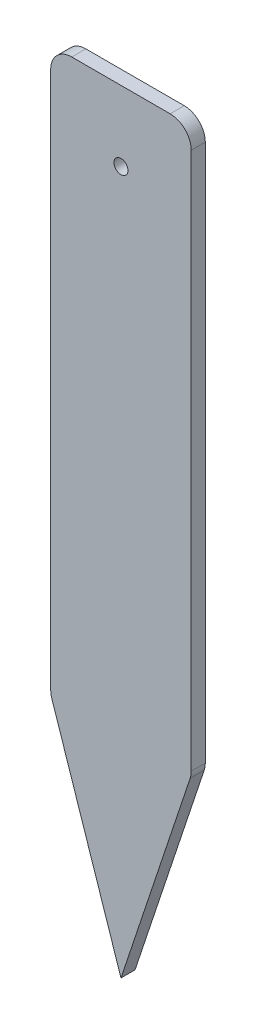
ISO-10303-21;
HEADER;
FILE_DESCRIPTION(('STEP AP214'),'2;1');
FILE_NAME('part.step','',(''),(''),'','','');
FILE_SCHEMA(('AUTOMOTIVE_DESIGN { 1 0 10303 214 1 1 1 1 }'));
ENDSEC;
DATA;
#1=APPLICATION_CONTEXT('core data for automotive mechanical design processes');
#2=APPLICATION_PROTOCOL_DEFINITION('international standard','automotive_design',2000,#1);
#3=PRODUCT_CONTEXT('',#1,'mechanical');
#4=PRODUCT('Part','Part','',(#3));
#5=PRODUCT_RELATED_PRODUCT_CATEGORY('part','',(#4));
#6=PRODUCT_DEFINITION_FORMATION('','',#4);
#7=PRODUCT_DEFINITION_CONTEXT('part definition',#1,'design');
#8=PRODUCT_DEFINITION('design','',#6,#7);
#9=PRODUCT_DEFINITION_SHAPE('','',#8);
#10=(LENGTH_UNIT() NAMED_UNIT(*) SI_UNIT(.MILLI.,.METRE.));
#11=(NAMED_UNIT(*) PLANE_ANGLE_UNIT() SI_UNIT($,.RADIAN.));
#12=(NAMED_UNIT(*) SI_UNIT($,.STERADIAN.) SOLID_ANGLE_UNIT());
#13=UNCERTAINTY_MEASURE_WITH_UNIT(LENGTH_MEASURE(1.E-05),#10,'distance_accuracy_value','');
#14=(GEOMETRIC_REPRESENTATION_CONTEXT(3) GLOBAL_UNCERTAINTY_ASSIGNED_CONTEXT((#13)) GLOBAL_UNIT_ASSIGNED_CONTEXT((#10,
#11,#12)) REPRESENTATION_CONTEXT('',''));
#15=CARTESIAN_POINT('',(0.,0.,0.));
#16=DIRECTION('',(0.,0.,1.));
#17=DIRECTION('',(1.,0.,0.));
#18=AXIS2_PLACEMENT_3D('',#15,#16,#17);
#19=CARTESIAN_POINT('',(7.,30.4868329805051,2.));
#20=DIRECTION('',(0.,0.,1.));
#21=DIRECTION('',(1.,0.,0.));
#22=AXIS2_PLACEMENT_3D('',#19,#20,#21);
#23=PLANE('',#22);
#24=CARTESIAN_POINT('',(7.,30.4868329805051,2.));
#25=DIRECTION('',(0.,0.,1.));
#26=DIRECTION('',(1.,0.,0.));
#27=AXIS2_PLACEMENT_3D('',#24,#25,#26);
#28=CIRCLE('',#27,3.);
#29=CARTESIAN_POINT('',(9.84604989415154,29.5381496824546,2.));
#30=VERTEX_POINT('',#29);
#31=CARTESIAN_POINT('',(10.,30.4868329805051,2.));
#32=VERTEX_POINT('',#31);
#33=EDGE_CURVE('E155',#30,#32,#28,.T.);
#34=ORIENTED_EDGE('',*,*,#33,.T.);
#35=DIRECTION('',(0.,1.,0.));
#36=VECTOR('',#35,1.);
#37=CARTESIAN_POINT('',(10.,30.4868329805051,2.));
#38=LINE('',#37,#36);
#39=CARTESIAN_POINT('',(10.,107.,2.));
#40=VERTEX_POINT('',#39);
#41=EDGE_CURVE('E98',#32,#40,#38,.T.);
#42=ORIENTED_EDGE('',*,*,#41,.T.);
#43=CARTESIAN_POINT('',(7.,107.,2.));
#44=DIRECTION('',(0.,0.,1.));
#45=DIRECTION('',(-1.,0.,0.));
#46=AXIS2_PLACEMENT_3D('',#43,#44,#45);
#47=CIRCLE('',#46,3.);
#48=CARTESIAN_POINT('',(6.99999999999998,110.,2.));
#49=VERTEX_POINT('',#48);
#50=EDGE_CURVE('E173',#40,#49,#47,.T.);
#51=ORIENTED_EDGE('',*,*,#50,.T.);
#52=DIRECTION('',(-1.,0.,0.));
#53=VECTOR('',#52,1.);
#54=CARTESIAN_POINT('',(-6.99999999999998,110.,2.));
#55=LINE('',#54,#53);
#56=CARTESIAN_POINT('',(-6.99999999999998,110.,2.));
#57=VERTEX_POINT('',#56);
#58=EDGE_CURVE('E190',#49,#57,#55,.T.);
#59=ORIENTED_EDGE('',*,*,#58,.T.);
#60=CARTESIAN_POINT('',(-7.,107.,2.));
#61=DIRECTION('',(0.,0.,1.));
#62=DIRECTION('',(-1.,0.,0.));
#63=AXIS2_PLACEMENT_3D('',#60,#61,#62);
#64=CIRCLE('',#63,3.);
#65=CARTESIAN_POINT('',(-10.,107.,2.));
#66=VERTEX_POINT('',#65);
#67=EDGE_CURVE('E189',#57,#66,#64,.T.);
#68=ORIENTED_EDGE('',*,*,#67,.T.);
#69=DIRECTION('',(0.,-1.,0.));
#70=VECTOR('',#69,1.);
#71=CARTESIAN_POINT('',(-10.,30.4868329805051,2.));
#72=LINE('',#71,#70);
#73=CARTESIAN_POINT('',(-10.,30.4868329805051,2.));
#74=VERTEX_POINT('',#73);
#75=EDGE_CURVE('E120',#66,#74,#72,.T.);
#76=ORIENTED_EDGE('',*,*,#75,.T.);
#77=CARTESIAN_POINT('',(-7.,30.4868329805051,2.));
#78=DIRECTION('',(0.,0.,1.));
#79=DIRECTION('',(-1.,0.,0.));
#80=AXIS2_PLACEMENT_3D('',#77,#78,#79);
#81=CIRCLE('',#80,3.);
#82=CARTESIAN_POINT('',(-9.84604989415154,29.5381496824546,2.));
#83=VERTEX_POINT('',#82);
#84=EDGE_CURVE('E114',#74,#83,#81,.T.);
#85=ORIENTED_EDGE('',*,*,#84,.T.);
#86=DIRECTION('',(0.316227766016838,-0.948683298050514,0.));
#87=VECTOR('',#86,1.);
#88=CARTESIAN_POINT('',(-9.84604989415154,29.5381496824546,2.));
#89=LINE('',#88,#87);
#90=CARTESIAN_POINT('',(0.,0.,2.));
#91=VERTEX_POINT('',#90);
#92=EDGE_CURVE('E118',#83,#91,#89,.T.);
#93=ORIENTED_EDGE('',*,*,#92,.T.);
#94=DIRECTION('',(0.316227766016838,0.948683298050514,0.));
#95=VECTOR('',#94,1.);
#96=CARTESIAN_POINT('',(0.,0.,2.));
#97=LINE('',#96,#95);
#98=EDGE_CURVE('E52',#91,#30,#97,.T.);
#99=ORIENTED_EDGE('',*,*,#98,.T.);
#100=EDGE_LOOP('',(#34,#42,#51,#59,#68,#76,#85,#93,#99));
#101=FACE_BOUND('',#100,.T.);
#102=CARTESIAN_POINT('',(0.,100.,2.));
#103=DIRECTION('',(0.,0.,1.));
#104=DIRECTION('',(1.,0.,0.));
#105=AXIS2_PLACEMENT_3D('',#102,#103,#104);
#106=CIRCLE('',#105,1.);
#107=CARTESIAN_POINT('',(1.,100.,2.));
#108=VERTEX_POINT('',#107);
#109=EDGE_CURVE('E142',#108,#108,#106,.T.);
#110=ORIENTED_EDGE('',*,*,#109,.F.);
#111=EDGE_LOOP('',(#110));
#112=FACE_BOUND('',#111,.T.);
#113=ADVANCED_FACE('F35',(#101,#112),#23,.T.);
#114=CARTESIAN_POINT('',(7.,30.4868329805051,0.));
#115=DIRECTION('',(0.,0.,1.));
#116=DIRECTION('',(1.,0.,0.));
#117=AXIS2_PLACEMENT_3D('',#114,#115,#116);
#118=PLANE('',#117);
#119=CARTESIAN_POINT('',(7.,30.4868329805051,0.));
#120=DIRECTION('',(0.,0.,1.));
#121=DIRECTION('',(1.,0.,0.));
#122=AXIS2_PLACEMENT_3D('',#119,#120,#121);
#123=CIRCLE('',#122,3.);
#124=CARTESIAN_POINT('',(9.84604989415154,29.5381496824546,0.));
#125=VERTEX_POINT('',#124);
#126=CARTESIAN_POINT('',(10.,30.4868329805051,0.));
#127=VERTEX_POINT('',#126);
#128=EDGE_CURVE('E138',#125,#127,#123,.T.);
#129=ORIENTED_EDGE('',*,*,#128,.F.);
#130=DIRECTION('',(0.316227766016838,0.948683298050514,0.));
#131=VECTOR('',#130,1.);
#132=CARTESIAN_POINT('',(0.,0.,0.));
#133=LINE('',#132,#131);
#134=CARTESIAN_POINT('',(0.,0.,0.));
#135=VERTEX_POINT('',#134);
#136=EDGE_CURVE('E90',#135,#125,#133,.T.);
#137=ORIENTED_EDGE('',*,*,#136,.F.);
#138=DIRECTION('',(0.316227766016838,-0.948683298050514,0.));
#139=VECTOR('',#138,1.);
#140=CARTESIAN_POINT('',(-9.84604989415154,29.5381496824546,0.));
#141=LINE('',#140,#139);
#142=CARTESIAN_POINT('',(-9.84604989415154,29.5381496824546,0.));
#143=VERTEX_POINT('',#142);
#144=EDGE_CURVE('E84',#143,#135,#141,.T.);
#145=ORIENTED_EDGE('',*,*,#144,.F.);
#146=CARTESIAN_POINT('',(-7.,30.4868329805051,0.));
#147=DIRECTION('',(0.,0.,1.));
#148=DIRECTION('',(-1.,0.,0.));
#149=AXIS2_PLACEMENT_3D('',#146,#147,#148);
#150=CIRCLE('',#149,3.);
#151=CARTESIAN_POINT('',(-10.,30.4868329805051,0.));
#152=VERTEX_POINT('',#151);
#153=EDGE_CURVE('E128',#152,#143,#150,.T.);
#154=ORIENTED_EDGE('',*,*,#153,.F.);
#155=DIRECTION('',(0.,-1.,0.));
#156=VECTOR('',#155,1.);
#157=CARTESIAN_POINT('',(-10.,30.4868329805051,0.));
#158=LINE('',#157,#156);
#159=CARTESIAN_POINT('',(-10.,107.,0.));
#160=VERTEX_POINT('',#159);
#161=EDGE_CURVE('E150',#160,#152,#158,.T.);
#162=ORIENTED_EDGE('',*,*,#161,.F.);
#163=CARTESIAN_POINT('',(-7.,107.,0.));
#164=DIRECTION('',(0.,0.,1.));
#165=DIRECTION('',(-1.,0.,0.));
#166=AXIS2_PLACEMENT_3D('',#163,#164,#165);
#167=CIRCLE('',#166,3.);
#168=CARTESIAN_POINT('',(-6.99999999999998,110.,0.));
#169=VERTEX_POINT('',#168);
#170=EDGE_CURVE('E148',#169,#160,#167,.T.);
#171=ORIENTED_EDGE('',*,*,#170,.F.);
#172=DIRECTION('',(-1.,0.,0.));
#173=VECTOR('',#172,1.);
#174=CARTESIAN_POINT('',(-6.99999999999998,110.,0.));
#175=LINE('',#174,#173);
#176=CARTESIAN_POINT('',(6.99999999999998,110.,0.));
#177=VERTEX_POINT('',#176);
#178=EDGE_CURVE('E146',#177,#169,#175,.T.);
#179=ORIENTED_EDGE('',*,*,#178,.F.);
#180=CARTESIAN_POINT('',(7.,107.,0.));
#181=DIRECTION('',(0.,0.,1.));
#182=DIRECTION('',(-1.,0.,0.));
#183=AXIS2_PLACEMENT_3D('',#180,#181,#182);
#184=CIRCLE('',#183,3.);
#185=CARTESIAN_POINT('',(10.,107.,0.));
#186=VERTEX_POINT('',#185);
#187=EDGE_CURVE('E144',#186,#177,#184,.T.);
#188=ORIENTED_EDGE('',*,*,#187,.F.);
#189=DIRECTION('',(0.,1.,0.));
#190=VECTOR('',#189,1.);
#191=CARTESIAN_POINT('',(10.,30.4868329805051,0.));
#192=LINE('',#191,#190);
#193=EDGE_CURVE('E141',#127,#186,#192,.T.);
#194=ORIENTED_EDGE('',*,*,#193,.F.);
#195=EDGE_LOOP('',(#129,#137,#145,#154,#162,#171,#179,#188,#194));
#196=FACE_BOUND('',#195,.T.);
#197=CARTESIAN_POINT('',(0.,100.,0.));
#198=DIRECTION('',(0.,0.,1.));
#199=DIRECTION('',(1.,0.,0.));
#200=AXIS2_PLACEMENT_3D('',#197,#198,#199);
#201=CIRCLE('',#200,1.);
#202=CARTESIAN_POINT('',(1.,100.,0.));
#203=VERTEX_POINT('',#202);
#204=EDGE_CURVE('E197',#203,#203,#201,.T.);
#205=ORIENTED_EDGE('',*,*,#204,.T.);
#206=EDGE_LOOP('',(#205));
#207=FACE_BOUND('',#206,.T.);
#208=ADVANCED_FACE('F177',(#196,#207),#118,.F.);
#209=CARTESIAN_POINT('',(7.,30.4868329805051,2.));
#210=DIRECTION('',(0.,0.,-1.));
#211=DIRECTION('',(-1.,0.,0.));
#212=AXIS2_PLACEMENT_3D('',#209,#210,#211);
#213=CYLINDRICAL_SURFACE('',#212,3.);
#214=ORIENTED_EDGE('',*,*,#128,.T.);
#215=DIRECTION('',(0.,0.,-1.));
#216=VECTOR('',#215,1.);
#217=CARTESIAN_POINT('',(10.,30.4868329805051,2.));
#218=LINE('',#217,#216);
#219=EDGE_CURVE('E11',#32,#127,#218,.T.);
#220=ORIENTED_EDGE('',*,*,#219,.F.);
#221=ORIENTED_EDGE('',*,*,#33,.F.);
#222=DIRECTION('',(0.,0.,-1.));
#223=VECTOR('',#222,1.);
#224=CARTESIAN_POINT('',(9.84604989415154,29.5381496824546,2.));
#225=LINE('',#224,#223);
#226=EDGE_CURVE('E134',#30,#125,#225,.T.);
#227=ORIENTED_EDGE('',*,*,#226,.T.);
#228=EDGE_LOOP('',(#214,#220,#221,#227));
#229=FACE_BOUND('',#228,.T.);
#230=ADVANCED_FACE('F37',(#229),#213,.T.);
#231=CARTESIAN_POINT('',(10.,30.4868329805051,2.));
#232=DIRECTION('',(-1.,0.,0.));
#233=DIRECTION('',(0.,-1.,0.));
#234=AXIS2_PLACEMENT_3D('',#231,#232,#233);
#235=PLANE('',#234);
#236=ORIENTED_EDGE('',*,*,#193,.T.);
#237=DIRECTION('',(0.,0.,-1.));
#238=VECTOR('',#237,1.);
#239=CARTESIAN_POINT('',(10.,107.,2.));
#240=LINE('',#239,#238);
#241=EDGE_CURVE('E44',#40,#186,#240,.T.);
#242=ORIENTED_EDGE('',*,*,#241,.F.);
#243=ORIENTED_EDGE('',*,*,#41,.F.);
#244=ORIENTED_EDGE('',*,*,#219,.T.);
#245=EDGE_LOOP('',(#236,#242,#243,#244));
#246=FACE_BOUND('',#245,.T.);
#247=ADVANCED_FACE('F229',(#246),#235,.F.);
#248=CARTESIAN_POINT('',(7.,107.,2.));
#249=DIRECTION('',(0.,0.,-1.));
#250=DIRECTION('',(-1.,0.,0.));
#251=AXIS2_PLACEMENT_3D('',#248,#249,#250);
#252=CYLINDRICAL_SURFACE('',#251,3.);
#253=ORIENTED_EDGE('',*,*,#187,.T.);
#254=DIRECTION('',(0.,0.,-1.));
#255=VECTOR('',#254,1.);
#256=CARTESIAN_POINT('',(6.99999999999998,110.,2.));
#257=LINE('',#256,#255);
#258=EDGE_CURVE('E165',#49,#177,#257,.T.);
#259=ORIENTED_EDGE('',*,*,#258,.F.);
#260=ORIENTED_EDGE('',*,*,#50,.F.);
#261=ORIENTED_EDGE('',*,*,#241,.T.);
#262=EDGE_LOOP('',(#253,#259,#260,#261));
#263=FACE_BOUND('',#262,.T.);
#264=ADVANCED_FACE('F171',(#263),#252,.T.);
#265=CARTESIAN_POINT('',(-6.99999999999998,110.,2.));
#266=DIRECTION('',(0.,-1.,0.));
#267=DIRECTION('',(0.,0.,-1.));
#268=AXIS2_PLACEMENT_3D('',#265,#266,#267);
#269=PLANE('',#268);
#270=ORIENTED_EDGE('',*,*,#178,.T.);
#271=DIRECTION('',(0.,0.,-1.));
#272=VECTOR('',#271,1.);
#273=CARTESIAN_POINT('',(-6.99999999999998,110.,2.));
#274=LINE('',#273,#272);
#275=EDGE_CURVE('E162',#57,#169,#274,.T.);
#276=ORIENTED_EDGE('',*,*,#275,.F.);
#277=ORIENTED_EDGE('',*,*,#58,.F.);
#278=ORIENTED_EDGE('',*,*,#258,.T.);
#279=EDGE_LOOP('',(#270,#276,#277,#278));
#280=FACE_BOUND('',#279,.T.);
#281=ADVANCED_FACE('F183',(#280),#269,.F.);
#282=CARTESIAN_POINT('',(-7.,107.,2.));
#283=DIRECTION('',(0.,0.,-1.));
#284=DIRECTION('',(-1.,0.,0.));
#285=AXIS2_PLACEMENT_3D('',#282,#283,#284);
#286=CYLINDRICAL_SURFACE('',#285,3.);
#287=ORIENTED_EDGE('',*,*,#170,.T.);
#288=DIRECTION('',(0.,0.,-1.));
#289=VECTOR('',#288,1.);
#290=CARTESIAN_POINT('',(-10.,107.,2.));
#291=LINE('',#290,#289);
#292=EDGE_CURVE('E159',#66,#160,#291,.T.);
#293=ORIENTED_EDGE('',*,*,#292,.F.);
#294=ORIENTED_EDGE('',*,*,#67,.F.);
#295=ORIENTED_EDGE('',*,*,#275,.T.);
#296=EDGE_LOOP('',(#287,#293,#294,#295));
#297=FACE_BOUND('',#296,.T.);
#298=ADVANCED_FACE('F187',(#297),#286,.T.);
#299=CARTESIAN_POINT('',(-10.,30.4868329805051,2.));
#300=DIRECTION('',(1.,0.,0.));
#301=DIRECTION('',(0.,1.,0.));
#302=AXIS2_PLACEMENT_3D('',#299,#300,#301);
#303=PLANE('',#302);
#304=ORIENTED_EDGE('',*,*,#161,.T.);
#305=DIRECTION('',(0.,0.,-1.));
#306=VECTOR('',#305,1.);
#307=CARTESIAN_POINT('',(-10.,30.4868329805051,2.));
#308=LINE('',#307,#306);
#309=EDGE_CURVE('E129',#74,#152,#308,.T.);
#310=ORIENTED_EDGE('',*,*,#309,.F.);
#311=ORIENTED_EDGE('',*,*,#75,.F.);
#312=ORIENTED_EDGE('',*,*,#292,.T.);
#313=EDGE_LOOP('',(#304,#310,#311,#312));
#314=FACE_BOUND('',#313,.T.);
#315=ADVANCED_FACE('F220',(#314),#303,.F.);
#316=CARTESIAN_POINT('',(-7.,30.4868329805051,2.));
#317=DIRECTION('',(0.,0.,-1.));
#318=DIRECTION('',(-1.,0.,0.));
#319=AXIS2_PLACEMENT_3D('',#316,#317,#318);
#320=CYLINDRICAL_SURFACE('',#319,3.);
#321=ORIENTED_EDGE('',*,*,#153,.T.);
#322=DIRECTION('',(0.,0.,-1.));
#323=VECTOR('',#322,1.);
#324=CARTESIAN_POINT('',(-9.84604989415154,29.5381496824546,2.));
#325=LINE('',#324,#323);
#326=EDGE_CURVE('E125',#83,#143,#325,.T.);
#327=ORIENTED_EDGE('',*,*,#326,.F.);
#328=ORIENTED_EDGE('',*,*,#84,.F.);
#329=ORIENTED_EDGE('',*,*,#309,.T.);
#330=EDGE_LOOP('',(#321,#327,#328,#329));
#331=FACE_BOUND('',#330,.T.);
#332=ADVANCED_FACE('F126',(#331),#320,.T.);
#333=CARTESIAN_POINT('',(-9.84604989415154,29.5381496824546,2.));
#334=DIRECTION('',(0.948683298050514,0.316227766016838,0.));
#335=DIRECTION('',(-0.316227766016838,0.948683298050514,0.));
#336=AXIS2_PLACEMENT_3D('',#333,#334,#335);
#337=PLANE('',#336);
#338=ORIENTED_EDGE('',*,*,#144,.T.);
#339=DIRECTION('',(0.,0.,-1.));
#340=VECTOR('',#339,1.);
#341=CARTESIAN_POINT('',(0.,0.,2.));
#342=LINE('',#341,#340);
#343=EDGE_CURVE('E130',#91,#135,#342,.T.);
#344=ORIENTED_EDGE('',*,*,#343,.F.);
#345=ORIENTED_EDGE('',*,*,#92,.F.);
#346=ORIENTED_EDGE('',*,*,#326,.T.);
#347=EDGE_LOOP('',(#338,#344,#345,#346));
#348=FACE_BOUND('',#347,.T.);
#349=ADVANCED_FACE('F132',(#348),#337,.F.);
#350=CARTESIAN_POINT('',(0.,0.,2.));
#351=DIRECTION('',(-0.948683298050514,0.316227766016838,0.));
#352=DIRECTION('',(-0.316227766016838,-0.948683298050514,0.));
#353=AXIS2_PLACEMENT_3D('',#350,#351,#352);
#354=PLANE('',#353);
#355=ORIENTED_EDGE('',*,*,#136,.T.);
#356=ORIENTED_EDGE('',*,*,#226,.F.);
#357=ORIENTED_EDGE('',*,*,#98,.F.);
#358=ORIENTED_EDGE('',*,*,#343,.T.);
#359=EDGE_LOOP('',(#355,#356,#357,#358));
#360=FACE_BOUND('',#359,.T.);
#361=ADVANCED_FACE('F213',(#360),#354,.F.);
#362=CARTESIAN_POINT('',(0.,100.,2.));
#363=DIRECTION('',(0.,0.,-1.));
#364=DIRECTION('',(-1.,0.,0.));
#365=AXIS2_PLACEMENT_3D('',#362,#363,#364);
#366=CYLINDRICAL_SURFACE('',#365,1.);
#367=ORIENTED_EDGE('',*,*,#109,.T.);
#368=EDGE_LOOP('',(#367));
#369=FACE_BOUND('',#368,.T.);
#370=ORIENTED_EDGE('',*,*,#204,.F.);
#371=EDGE_LOOP('',(#370));
#372=FACE_BOUND('',#371,.T.);
#373=ADVANCED_FACE('F203',(#369,#372),#366,.F.);
#374=CLOSED_SHELL('',(#113,#208,#230,#247,#264,#281,#298,#315,#332,#349,#361,#373));
#375=MANIFOLD_SOLID_BREP('B2',#374);
#376=ADVANCED_BREP_SHAPE_REPRESENTATION('',(#18,#375),#14);
#377=SHAPE_DEFINITION_REPRESENTATION(#9,#376);
ENDSEC;
END-ISO-10303-21;
